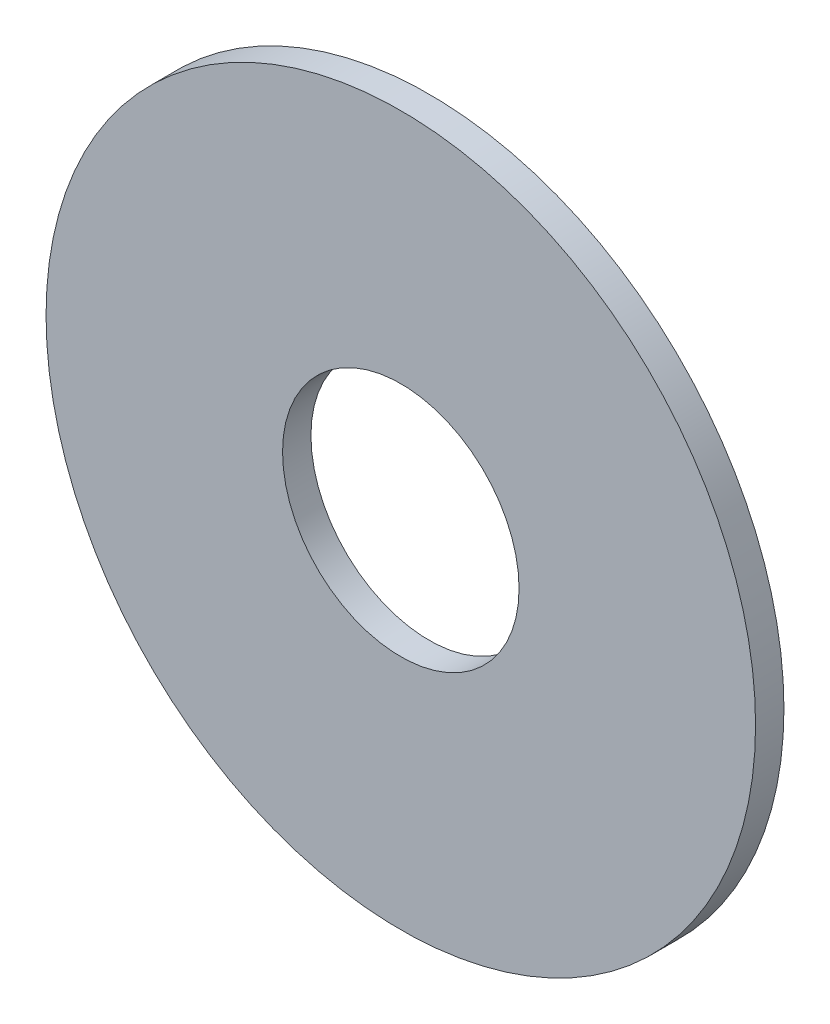
ISO-10303-21;
HEADER;
FILE_DESCRIPTION(('STEP AP214'),'2;1');
FILE_NAME('part.step','',(''),(''),'','','');
FILE_SCHEMA(('AUTOMOTIVE_DESIGN { 1 0 10303 214 1 1 1 1 }'));
ENDSEC;
DATA;
#1=APPLICATION_CONTEXT('core data for automotive mechanical design processes');
#2=APPLICATION_PROTOCOL_DEFINITION('international standard','automotive_design',2000,#1);
#3=PRODUCT_CONTEXT('',#1,'mechanical');
#4=PRODUCT('Part','Part','',(#3));
#5=PRODUCT_RELATED_PRODUCT_CATEGORY('part','',(#4));
#6=PRODUCT_DEFINITION_FORMATION('','',#4);
#7=PRODUCT_DEFINITION_CONTEXT('part definition',#1,'design');
#8=PRODUCT_DEFINITION('design','',#6,#7);
#9=PRODUCT_DEFINITION_SHAPE('','',#8);
#10=(LENGTH_UNIT() NAMED_UNIT(*) SI_UNIT(.MILLI.,.METRE.));
#11=(NAMED_UNIT(*) PLANE_ANGLE_UNIT() SI_UNIT($,.RADIAN.));
#12=(NAMED_UNIT(*) SI_UNIT($,.STERADIAN.) SOLID_ANGLE_UNIT());
#13=UNCERTAINTY_MEASURE_WITH_UNIT(LENGTH_MEASURE(1.E-05),#10,'distance_accuracy_value','');
#14=(GEOMETRIC_REPRESENTATION_CONTEXT(3) GLOBAL_UNCERTAINTY_ASSIGNED_CONTEXT((#13)) GLOBAL_UNIT_ASSIGNED_CONTEXT((#10,
#11,#12)) REPRESENTATION_CONTEXT('',''));
#15=CARTESIAN_POINT('',(0.,0.,0.));
#16=DIRECTION('',(0.,0.,1.));
#17=DIRECTION('',(1.,0.,0.));
#18=AXIS2_PLACEMENT_3D('',#15,#16,#17);
#19=CARTESIAN_POINT('',(0.,0.,0.6));
#20=DIRECTION('',(0.,0.,1.));
#21=DIRECTION('',(1.,0.,0.));
#22=AXIS2_PLACEMENT_3D('',#19,#20,#21);
#23=PLANE('',#22);
#24=CARTESIAN_POINT('',(0.,0.,0.6));
#25=DIRECTION('',(0.,0.,1.));
#26=DIRECTION('',(1.,0.,0.));
#27=AXIS2_PLACEMENT_3D('',#24,#25,#26);
#28=CIRCLE('',#27,7.5);
#29=CARTESIAN_POINT('',(7.5,0.,0.6));
#30=VERTEX_POINT('',#29);
#31=EDGE_CURVE('E10',#30,#30,#28,.T.);
#32=ORIENTED_EDGE('',*,*,#31,.T.);
#33=EDGE_LOOP('',(#32));
#34=FACE_BOUND('',#33,.T.);
#35=CARTESIAN_POINT('',(0.,0.,0.6));
#36=DIRECTION('',(0.,0.,1.));
#37=DIRECTION('',(1.,0.,0.));
#38=AXIS2_PLACEMENT_3D('',#35,#36,#37);
#39=CIRCLE('',#38,2.5);
#40=CARTESIAN_POINT('',(2.5,0.,0.6));
#41=VERTEX_POINT('',#40);
#42=EDGE_CURVE('E42',#41,#41,#39,.T.);
#43=ORIENTED_EDGE('',*,*,#42,.F.);
#44=EDGE_LOOP('',(#43));
#45=FACE_BOUND('',#44,.T.);
#46=ADVANCED_FACE('F31',(#34,#45),#23,.T.);
#47=CARTESIAN_POINT('',(0.,0.,0.));
#48=DIRECTION('',(0.,0.,1.));
#49=DIRECTION('',(1.,0.,0.));
#50=AXIS2_PLACEMENT_3D('',#47,#48,#49);
#51=PLANE('',#50);
#52=CARTESIAN_POINT('',(0.,0.,0.));
#53=DIRECTION('',(0.,0.,1.));
#54=DIRECTION('',(1.,0.,0.));
#55=AXIS2_PLACEMENT_3D('',#52,#53,#54);
#56=CIRCLE('',#55,7.5);
#57=CARTESIAN_POINT('',(7.5,0.,0.));
#58=VERTEX_POINT('',#57);
#59=EDGE_CURVE('E35',#58,#58,#56,.T.);
#60=ORIENTED_EDGE('',*,*,#59,.F.);
#61=EDGE_LOOP('',(#60));
#62=FACE_BOUND('',#61,.T.);
#63=CARTESIAN_POINT('',(0.,0.,0.));
#64=DIRECTION('',(0.,0.,1.));
#65=DIRECTION('',(1.,0.,0.));
#66=AXIS2_PLACEMENT_3D('',#63,#64,#65);
#67=CIRCLE('',#66,2.5);
#68=CARTESIAN_POINT('',(2.5,0.,0.));
#69=VERTEX_POINT('',#68);
#70=EDGE_CURVE('E44',#69,#69,#67,.T.);
#71=ORIENTED_EDGE('',*,*,#70,.T.);
#72=EDGE_LOOP('',(#71));
#73=FACE_BOUND('',#72,.T.);
#74=ADVANCED_FACE('F54',(#62,#73),#51,.F.);
#75=CARTESIAN_POINT('',(0.,0.,0.6));
#76=DIRECTION('',(0.,0.,-1.));
#77=DIRECTION('',(-1.,0.,0.));
#78=AXIS2_PLACEMENT_3D('',#75,#76,#77);
#79=CYLINDRICAL_SURFACE('',#78,7.5);
#80=ORIENTED_EDGE('',*,*,#31,.F.);
#81=EDGE_LOOP('',(#80));
#82=FACE_BOUND('',#81,.T.);
#83=ORIENTED_EDGE('',*,*,#59,.T.);
#84=EDGE_LOOP('',(#83));
#85=FACE_BOUND('',#84,.T.);
#86=ADVANCED_FACE('F33',(#82,#85),#79,.T.);
#87=CARTESIAN_POINT('',(0.,0.,0.6));
#88=DIRECTION('',(0.,0.,-1.));
#89=DIRECTION('',(-1.,0.,0.));
#90=AXIS2_PLACEMENT_3D('',#87,#88,#89);
#91=CYLINDRICAL_SURFACE('',#90,2.5);
#92=ORIENTED_EDGE('',*,*,#42,.T.);
#93=EDGE_LOOP('',(#92));
#94=FACE_BOUND('',#93,.T.);
#95=ORIENTED_EDGE('',*,*,#70,.F.);
#96=EDGE_LOOP('',(#95));
#97=FACE_BOUND('',#96,.T.);
#98=ADVANCED_FACE('F50',(#94,#97),#91,.F.);
#99=CLOSED_SHELL('',(#46,#74,#86,#98));
#100=MANIFOLD_SOLID_BREP('B2',#99);
#101=ADVANCED_BREP_SHAPE_REPRESENTATION('',(#18,#100),#14);
#102=SHAPE_DEFINITION_REPRESENTATION(#9,#101);
ENDSEC;
END-ISO-10303-21;
